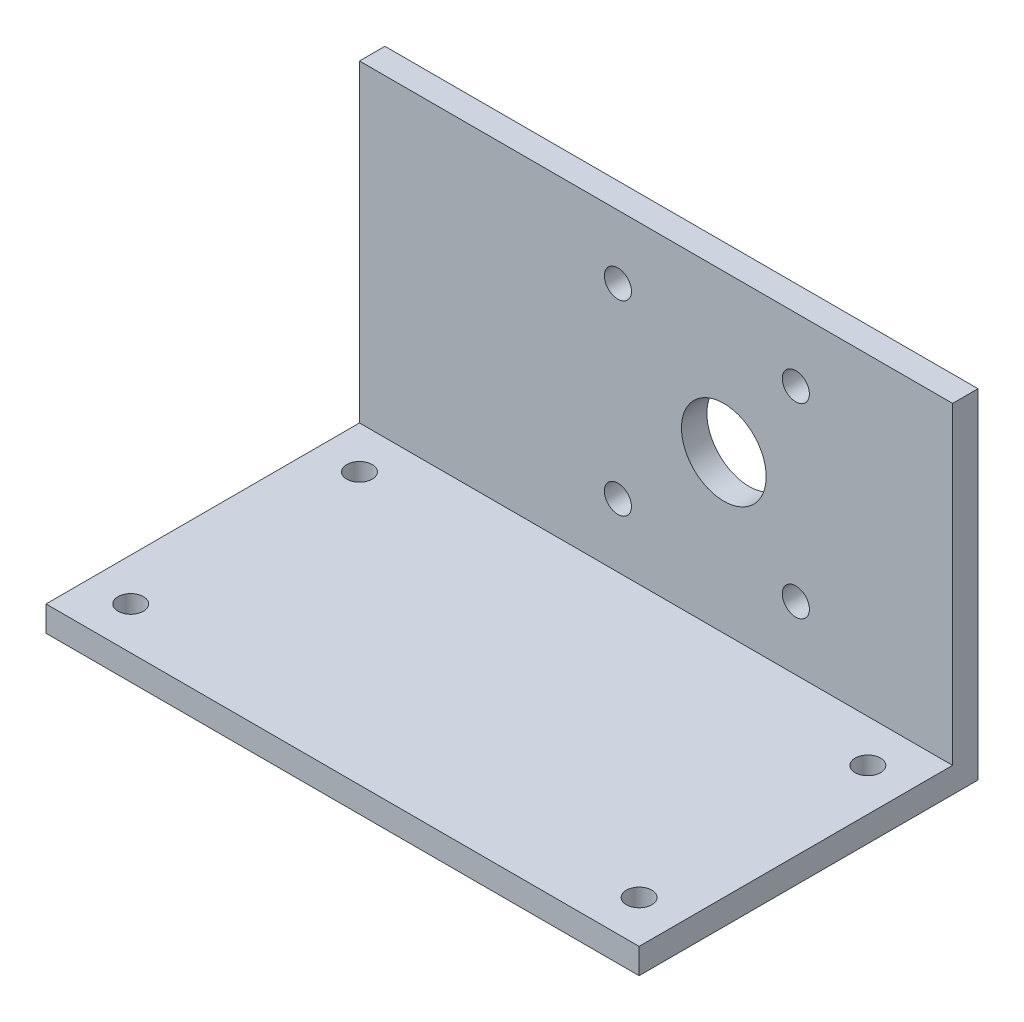
ISO-10303-21;
HEADER;
FILE_DESCRIPTION(('STEP AP214'),'2;1');
FILE_NAME('part.step','',(''),(''),'','','');
FILE_SCHEMA(('AUTOMOTIVE_DESIGN { 1 0 10303 214 1 1 1 1 }'));
ENDSEC;
DATA;
#1=APPLICATION_CONTEXT('core data for automotive mechanical design processes');
#2=APPLICATION_PROTOCOL_DEFINITION('international standard','automotive_design',2000,#1);
#3=PRODUCT_CONTEXT('',#1,'mechanical');
#4=PRODUCT('Part','Part','',(#3));
#5=PRODUCT_RELATED_PRODUCT_CATEGORY('part','',(#4));
#6=PRODUCT_DEFINITION_FORMATION('','',#4);
#7=PRODUCT_DEFINITION_CONTEXT('part definition',#1,'design');
#8=PRODUCT_DEFINITION('design','',#6,#7);
#9=PRODUCT_DEFINITION_SHAPE('','',#8);
#10=(LENGTH_UNIT() NAMED_UNIT(*) SI_UNIT(.MILLI.,.METRE.));
#11=(NAMED_UNIT(*) PLANE_ANGLE_UNIT() SI_UNIT($,.RADIAN.));
#12=(NAMED_UNIT(*) SI_UNIT($,.STERADIAN.) SOLID_ANGLE_UNIT());
#13=UNCERTAINTY_MEASURE_WITH_UNIT(LENGTH_MEASURE(1.E-05),#10,'distance_accuracy_value','');
#14=(GEOMETRIC_REPRESENTATION_CONTEXT(3) GLOBAL_UNCERTAINTY_ASSIGNED_CONTEXT((#13)) GLOBAL_UNIT_ASSIGNED_CONTEXT((#10,
#11,#12)) REPRESENTATION_CONTEXT('',''));
#15=CARTESIAN_POINT('',(0.,0.,0.));
#16=DIRECTION('',(0.,0.,1.));
#17=DIRECTION('',(1.,0.,0.));
#18=AXIS2_PLACEMENT_3D('',#15,#16,#17);
#19=CARTESIAN_POINT('',(70.,20.,-17.));
#20=DIRECTION('',(0.,0.,-1.));
#21=DIRECTION('',(0.,1.,0.));
#22=AXIS2_PLACEMENT_3D('',#19,#20,#21);
#23=PLANE('',#22);
#24=CARTESIAN_POINT('',(51.5,-9.50000000000001,-17.));
#25=DIRECTION('',(0.,0.,1.));
#26=DIRECTION('',(1.,0.,0.));
#27=AXIS2_PLACEMENT_3D('',#24,#25,#26);
#28=CIRCLE('',#27,1.6);
#29=CARTESIAN_POINT('',(53.1,-9.50000000000001,-17.));
#30=VERTEX_POINT('',#29);
#31=EDGE_CURVE('E164',#30,#30,#28,.T.);
#32=ORIENTED_EDGE('',*,*,#31,.F.);
#33=EDGE_LOOP('',(#32));
#34=FACE_BOUND('',#33,.T.);
#35=CARTESIAN_POINT('',(30.5,-9.50000000000001,-17.));
#36=DIRECTION('',(0.,0.,1.));
#37=DIRECTION('',(1.,0.,0.));
#38=AXIS2_PLACEMENT_3D('',#35,#36,#37);
#39=CIRCLE('',#38,1.6);
#40=CARTESIAN_POINT('',(32.1,-9.50000000000001,-17.));
#41=VERTEX_POINT('',#40);
#42=EDGE_CURVE('E168',#41,#41,#39,.T.);
#43=ORIENTED_EDGE('',*,*,#42,.F.);
#44=EDGE_LOOP('',(#43));
#45=FACE_BOUND('',#44,.T.);
#46=CARTESIAN_POINT('',(30.5,12.5,-17.));
#47=DIRECTION('',(0.,0.,1.));
#48=DIRECTION('',(1.,0.,0.));
#49=AXIS2_PLACEMENT_3D('',#46,#47,#48);
#50=CIRCLE('',#49,1.6);
#51=CARTESIAN_POINT('',(32.1,12.5,-17.));
#52=VERTEX_POINT('',#51);
#53=EDGE_CURVE('E172',#52,#52,#50,.T.);
#54=ORIENTED_EDGE('',*,*,#53,.F.);
#55=EDGE_LOOP('',(#54));
#56=FACE_BOUND('',#55,.T.);
#57=CARTESIAN_POINT('',(51.5,12.5,-17.));
#58=DIRECTION('',(0.,0.,1.));
#59=DIRECTION('',(1.,0.,0.));
#60=AXIS2_PLACEMENT_3D('',#57,#58,#59);
#61=CIRCLE('',#60,1.6);
#62=CARTESIAN_POINT('',(53.1,12.5,-17.));
#63=VERTEX_POINT('',#62);
#64=EDGE_CURVE('E176',#63,#63,#61,.T.);
#65=ORIENTED_EDGE('',*,*,#64,.F.);
#66=EDGE_LOOP('',(#65));
#67=FACE_BOUND('',#66,.T.);
#68=CARTESIAN_POINT('',(43.,1.5,-17.));
#69=DIRECTION('',(0.,0.,1.));
#70=DIRECTION('',(1.,0.,0.));
#71=AXIS2_PLACEMENT_3D('',#68,#69,#70);
#72=CIRCLE('',#71,5.);
#73=CARTESIAN_POINT('',(48.,1.5,-17.));
#74=VERTEX_POINT('',#73);
#75=EDGE_CURVE('E179',#74,#74,#72,.T.);
#76=ORIENTED_EDGE('',*,*,#75,.F.);
#77=EDGE_LOOP('',(#76));
#78=FACE_BOUND('',#77,.T.);
#79=DIRECTION('',(0.,-1.,0.));
#80=VECTOR('',#79,1.);
#81=CARTESIAN_POINT('',(0.,20.,-17.));
#82=LINE('',#81,#80);
#83=CARTESIAN_POINT('',(0.,20.,-17.));
#84=VERTEX_POINT('',#83);
#85=CARTESIAN_POINT('',(0.,-17.,-17.));
#86=VERTEX_POINT('',#85);
#87=EDGE_CURVE('E119',#84,#86,#82,.T.);
#88=ORIENTED_EDGE('',*,*,#87,.T.);
#89=DIRECTION('',(-1.,0.,0.));
#90=VECTOR('',#89,1.);
#91=CARTESIAN_POINT('',(70.,-17.,-17.));
#92=LINE('',#91,#90);
#93=CARTESIAN_POINT('',(70.,-17.,-17.));
#94=VERTEX_POINT('',#93);
#95=EDGE_CURVE('E11',#94,#86,#92,.T.);
#96=ORIENTED_EDGE('',*,*,#95,.F.);
#97=DIRECTION('',(0.,-1.,0.));
#98=VECTOR('',#97,1.);
#99=CARTESIAN_POINT('',(70.,20.,-17.));
#100=LINE('',#99,#98);
#101=CARTESIAN_POINT('',(70.,20.,-17.));
#102=VERTEX_POINT('',#101);
#103=EDGE_CURVE('E130',#102,#94,#100,.T.);
#104=ORIENTED_EDGE('',*,*,#103,.F.);
#105=DIRECTION('',(-1.,0.,0.));
#106=VECTOR('',#105,1.);
#107=CARTESIAN_POINT('',(70.,20.,-17.));
#108=LINE('',#107,#106);
#109=EDGE_CURVE('E115',#102,#84,#108,.T.);
#110=ORIENTED_EDGE('',*,*,#109,.T.);
#111=EDGE_LOOP('',(#88,#96,#104,#110));
#112=FACE_BOUND('',#111,.T.);
#113=ADVANCED_FACE('F35',(#34,#45,#56,#67,#78,#112),#23,.F.);
#114=CARTESIAN_POINT('',(70.,-17.,-17.));
#115=DIRECTION('',(0.,-1.,0.));
#116=DIRECTION('',(0.,0.,-1.));
#117=AXIS2_PLACEMENT_3D('',#114,#115,#116);
#118=PLANE('',#117);
#119=CARTESIAN_POINT('',(5.,-17.,-12.));
#120=DIRECTION('',(0.,1.,0.));
#121=DIRECTION('',(0.,0.,1.));
#122=AXIS2_PLACEMENT_3D('',#119,#120,#121);
#123=CIRCLE('',#122,1.5);
#124=CARTESIAN_POINT('',(5.,-17.,-10.5));
#125=VERTEX_POINT('',#124);
#126=EDGE_CURVE('E224',#125,#125,#123,.T.);
#127=ORIENTED_EDGE('',*,*,#126,.F.);
#128=EDGE_LOOP('',(#127));
#129=FACE_BOUND('',#128,.T.);
#130=CARTESIAN_POINT('',(5.,-17.,15.));
#131=DIRECTION('',(0.,1.,0.));
#132=DIRECTION('',(0.,0.,-1.));
#133=AXIS2_PLACEMENT_3D('',#130,#131,#132);
#134=CIRCLE('',#133,1.5);
#135=CARTESIAN_POINT('',(5.,-17.,16.5));
#136=VERTEX_POINT('',#135);
#137=EDGE_CURVE('E218',#136,#136,#134,.T.);
#138=ORIENTED_EDGE('',*,*,#137,.F.);
#139=EDGE_LOOP('',(#138));
#140=FACE_BOUND('',#139,.T.);
#141=CARTESIAN_POINT('',(65.,-17.,-12.));
#142=DIRECTION('',(0.,1.,0.));
#143=DIRECTION('',(0.,0.,-1.));
#144=AXIS2_PLACEMENT_3D('',#141,#142,#143);
#145=CIRCLE('',#144,1.5);
#146=CARTESIAN_POINT('',(65.,-17.,-10.5));
#147=VERTEX_POINT('',#146);
#148=EDGE_CURVE('E212',#147,#147,#145,.T.);
#149=ORIENTED_EDGE('',*,*,#148,.F.);
#150=EDGE_LOOP('',(#149));
#151=FACE_BOUND('',#150,.T.);
#152=CARTESIAN_POINT('',(65.,-17.,15.));
#153=DIRECTION('',(0.,1.,0.));
#154=DIRECTION('',(0.,0.,1.));
#155=AXIS2_PLACEMENT_3D('',#152,#153,#154);
#156=CIRCLE('',#155,1.5);
#157=CARTESIAN_POINT('',(65.,-17.,16.5));
#158=VERTEX_POINT('',#157);
#159=EDGE_CURVE('E206',#158,#158,#156,.T.);
#160=ORIENTED_EDGE('',*,*,#159,.F.);
#161=EDGE_LOOP('',(#160));
#162=FACE_BOUND('',#161,.T.);
#163=DIRECTION('',(0.,0.,1.));
#164=VECTOR('',#163,1.);
#165=CARTESIAN_POINT('',(0.,-17.,-17.));
#166=LINE('',#165,#164);
#167=CARTESIAN_POINT('',(0.,-17.,20.));
#168=VERTEX_POINT('',#167);
#169=EDGE_CURVE('E122',#86,#168,#166,.T.);
#170=ORIENTED_EDGE('',*,*,#169,.T.);
#171=DIRECTION('',(-1.,0.,0.));
#172=VECTOR('',#171,1.);
#173=CARTESIAN_POINT('',(70.,-17.,20.));
#174=LINE('',#173,#172);
#175=CARTESIAN_POINT('',(70.,-17.,20.));
#176=VERTEX_POINT('',#175);
#177=EDGE_CURVE('E43',#176,#168,#174,.T.);
#178=ORIENTED_EDGE('',*,*,#177,.F.);
#179=DIRECTION('',(0.,0.,1.));
#180=VECTOR('',#179,1.);
#181=CARTESIAN_POINT('',(70.,-17.,-17.));
#182=LINE('',#181,#180);
#183=EDGE_CURVE('E88',#94,#176,#182,.T.);
#184=ORIENTED_EDGE('',*,*,#183,.F.);
#185=ORIENTED_EDGE('',*,*,#95,.T.);
#186=EDGE_LOOP('',(#170,#178,#184,#185));
#187=FACE_BOUND('',#186,.T.);
#188=ADVANCED_FACE('F155',(#129,#140,#151,#162,#187),#118,.F.);
#189=CARTESIAN_POINT('',(70.,-17.,20.));
#190=DIRECTION('',(0.,0.,-1.));
#191=DIRECTION('',(-1.,0.,0.));
#192=AXIS2_PLACEMENT_3D('',#189,#190,#191);
#193=PLANE('',#192);
#194=DIRECTION('',(0.,-1.,0.));
#195=VECTOR('',#194,1.);
#196=CARTESIAN_POINT('',(0.,-17.,20.));
#197=LINE('',#196,#195);
#198=CARTESIAN_POINT('',(0.,-20.,20.));
#199=VERTEX_POINT('',#198);
#200=EDGE_CURVE('E125',#168,#199,#197,.T.);
#201=ORIENTED_EDGE('',*,*,#200,.T.);
#202=DIRECTION('',(-1.,0.,0.));
#203=VECTOR('',#202,1.);
#204=CARTESIAN_POINT('',(70.,-20.,20.));
#205=LINE('',#204,#203);
#206=CARTESIAN_POINT('',(70.,-20.,20.));
#207=VERTEX_POINT('',#206);
#208=EDGE_CURVE('E110',#207,#199,#205,.T.);
#209=ORIENTED_EDGE('',*,*,#208,.F.);
#210=DIRECTION('',(0.,-1.,0.));
#211=VECTOR('',#210,1.);
#212=CARTESIAN_POINT('',(70.,-17.,20.));
#213=LINE('',#212,#211);
#214=EDGE_CURVE('E101',#176,#207,#213,.T.);
#215=ORIENTED_EDGE('',*,*,#214,.F.);
#216=ORIENTED_EDGE('',*,*,#177,.T.);
#217=EDGE_LOOP('',(#201,#209,#215,#216));
#218=FACE_BOUND('',#217,.T.);
#219=ADVANCED_FACE('F136',(#218),#193,.F.);
#220=CARTESIAN_POINT('',(70.,-20.,20.));
#221=DIRECTION('',(0.,1.,0.));
#222=DIRECTION('',(0.,0.,1.));
#223=AXIS2_PLACEMENT_3D('',#220,#221,#222);
#224=PLANE('',#223);
#225=CARTESIAN_POINT('',(5.,-20.,-12.));
#226=DIRECTION('',(0.,1.,0.));
#227=DIRECTION('',(0.,0.,1.));
#228=AXIS2_PLACEMENT_3D('',#225,#226,#227);
#229=CIRCLE('',#228,1.5);
#230=CARTESIAN_POINT('',(5.,-20.,-10.5));
#231=VERTEX_POINT('',#230);
#232=EDGE_CURVE('E221',#231,#231,#229,.F.);
#233=ORIENTED_EDGE('',*,*,#232,.F.);
#234=EDGE_LOOP('',(#233));
#235=FACE_BOUND('',#234,.T.);
#236=CARTESIAN_POINT('',(5.,-20.,15.));
#237=DIRECTION('',(0.,1.,0.));
#238=DIRECTION('',(0.,0.,1.));
#239=AXIS2_PLACEMENT_3D('',#236,#237,#238);
#240=CIRCLE('',#239,1.5);
#241=CARTESIAN_POINT('',(5.,-20.,16.5));
#242=VERTEX_POINT('',#241);
#243=EDGE_CURVE('E215',#242,#242,#240,.F.);
#244=ORIENTED_EDGE('',*,*,#243,.F.);
#245=EDGE_LOOP('',(#244));
#246=FACE_BOUND('',#245,.T.);
#247=CARTESIAN_POINT('',(65.,-20.,-12.));
#248=DIRECTION('',(0.,1.,0.));
#249=DIRECTION('',(0.,0.,1.));
#250=AXIS2_PLACEMENT_3D('',#247,#248,#249);
#251=CIRCLE('',#250,1.5);
#252=CARTESIAN_POINT('',(65.,-20.,-10.5));
#253=VERTEX_POINT('',#252);
#254=EDGE_CURVE('E209',#253,#253,#251,.F.);
#255=ORIENTED_EDGE('',*,*,#254,.F.);
#256=EDGE_LOOP('',(#255));
#257=FACE_BOUND('',#256,.T.);
#258=CARTESIAN_POINT('',(65.,-20.,15.));
#259=DIRECTION('',(0.,1.,0.));
#260=DIRECTION('',(0.,0.,1.));
#261=AXIS2_PLACEMENT_3D('',#258,#259,#260);
#262=CIRCLE('',#261,1.5);
#263=CARTESIAN_POINT('',(65.,-20.,16.5));
#264=VERTEX_POINT('',#263);
#265=EDGE_CURVE('E203',#264,#264,#262,.F.);
#266=ORIENTED_EDGE('',*,*,#265,.F.);
#267=EDGE_LOOP('',(#266));
#268=FACE_BOUND('',#267,.T.);
#269=DIRECTION('',(0.,0.,-1.));
#270=VECTOR('',#269,1.);
#271=CARTESIAN_POINT('',(0.,-20.,20.));
#272=LINE('',#271,#270);
#273=CARTESIAN_POINT('',(0.,-20.,-20.));
#274=VERTEX_POINT('',#273);
#275=EDGE_CURVE('E109',#199,#274,#272,.T.);
#276=ORIENTED_EDGE('',*,*,#275,.T.);
#277=DIRECTION('',(-1.,0.,0.));
#278=VECTOR('',#277,1.);
#279=CARTESIAN_POINT('',(70.,-20.,-20.));
#280=LINE('',#279,#278);
#281=CARTESIAN_POINT('',(70.,-20.,-20.));
#282=VERTEX_POINT('',#281);
#283=EDGE_CURVE('E106',#282,#274,#280,.T.);
#284=ORIENTED_EDGE('',*,*,#283,.F.);
#285=DIRECTION('',(0.,0.,-1.));
#286=VECTOR('',#285,1.);
#287=CARTESIAN_POINT('',(70.,-20.,20.));
#288=LINE('',#287,#286);
#289=EDGE_CURVE('E95',#207,#282,#288,.T.);
#290=ORIENTED_EDGE('',*,*,#289,.F.);
#291=ORIENTED_EDGE('',*,*,#208,.T.);
#292=EDGE_LOOP('',(#276,#284,#290,#291));
#293=FACE_BOUND('',#292,.T.);
#294=ADVANCED_FACE('F107',(#235,#246,#257,#268,#293),#224,.F.);
#295=CARTESIAN_POINT('',(70.,20.,-20.));
#296=DIRECTION('',(0.,0.,1.));
#297=DIRECTION('',(0.,-1.,0.));
#298=AXIS2_PLACEMENT_3D('',#295,#296,#297);
#299=PLANE('',#298);
#300=CARTESIAN_POINT('',(51.5,-9.50000000000001,-20.));
#301=DIRECTION('',(0.,0.,1.));
#302=DIRECTION('',(0.,-1.,0.));
#303=AXIS2_PLACEMENT_3D('',#300,#301,#302);
#304=CIRCLE('',#303,1.6);
#305=CARTESIAN_POINT('',(51.5,-11.1,-20.));
#306=VERTEX_POINT('',#305);
#307=EDGE_CURVE('E199',#306,#306,#304,.F.);
#308=ORIENTED_EDGE('',*,*,#307,.F.);
#309=EDGE_LOOP('',(#308));
#310=FACE_BOUND('',#309,.T.);
#311=CARTESIAN_POINT('',(30.5,-9.50000000000001,-20.));
#312=DIRECTION('',(0.,0.,1.));
#313=DIRECTION('',(0.,-1.,0.));
#314=AXIS2_PLACEMENT_3D('',#311,#312,#313);
#315=CIRCLE('',#314,1.6);
#316=CARTESIAN_POINT('',(30.5,-11.1,-20.));
#317=VERTEX_POINT('',#316);
#318=EDGE_CURVE('E195',#317,#317,#315,.F.);
#319=ORIENTED_EDGE('',*,*,#318,.F.);
#320=EDGE_LOOP('',(#319));
#321=FACE_BOUND('',#320,.T.);
#322=CARTESIAN_POINT('',(30.5,12.5,-20.));
#323=DIRECTION('',(0.,0.,1.));
#324=DIRECTION('',(0.,-1.,0.));
#325=AXIS2_PLACEMENT_3D('',#322,#323,#324);
#326=CIRCLE('',#325,1.6);
#327=CARTESIAN_POINT('',(30.5,10.9,-20.));
#328=VERTEX_POINT('',#327);
#329=EDGE_CURVE('E191',#328,#328,#326,.F.);
#330=ORIENTED_EDGE('',*,*,#329,.F.);
#331=EDGE_LOOP('',(#330));
#332=FACE_BOUND('',#331,.T.);
#333=CARTESIAN_POINT('',(51.5,12.5,-20.));
#334=DIRECTION('',(0.,0.,1.));
#335=DIRECTION('',(0.,-1.,0.));
#336=AXIS2_PLACEMENT_3D('',#333,#334,#335);
#337=CIRCLE('',#336,1.6);
#338=CARTESIAN_POINT('',(51.5,10.9,-20.));
#339=VERTEX_POINT('',#338);
#340=EDGE_CURVE('E181',#339,#339,#337,.F.);
#341=ORIENTED_EDGE('',*,*,#340,.F.);
#342=EDGE_LOOP('',(#341));
#343=FACE_BOUND('',#342,.T.);
#344=CARTESIAN_POINT('',(43.,1.5,-20.));
#345=DIRECTION('',(0.,0.,1.));
#346=DIRECTION('',(0.,-1.,0.));
#347=AXIS2_PLACEMENT_3D('',#344,#345,#346);
#348=CIRCLE('',#347,5.);
#349=CARTESIAN_POINT('',(43.,-3.5,-20.));
#350=VERTEX_POINT('',#349);
#351=EDGE_CURVE('E123',#350,#350,#348,.F.);
#352=ORIENTED_EDGE('',*,*,#351,.F.);
#353=EDGE_LOOP('',(#352));
#354=FACE_BOUND('',#353,.T.);
#355=DIRECTION('',(0.,1.,0.));
#356=VECTOR('',#355,1.);
#357=CARTESIAN_POINT('',(0.,20.,-20.));
#358=LINE('',#357,#356);
#359=CARTESIAN_POINT('',(0.,20.,-20.));
#360=VERTEX_POINT('',#359);
#361=EDGE_CURVE('E74',#274,#360,#358,.T.);
#362=ORIENTED_EDGE('',*,*,#361,.T.);
#363=DIRECTION('',(-1.,0.,0.));
#364=VECTOR('',#363,1.);
#365=CARTESIAN_POINT('',(70.,20.,-20.));
#366=LINE('',#365,#364);
#367=CARTESIAN_POINT('',(70.,20.,-20.));
#368=VERTEX_POINT('',#367);
#369=EDGE_CURVE('E111',#368,#360,#366,.T.);
#370=ORIENTED_EDGE('',*,*,#369,.F.);
#371=DIRECTION('',(0.,1.,0.));
#372=VECTOR('',#371,1.);
#373=CARTESIAN_POINT('',(70.,20.,-20.));
#374=LINE('',#373,#372);
#375=EDGE_CURVE('E99',#282,#368,#374,.T.);
#376=ORIENTED_EDGE('',*,*,#375,.F.);
#377=ORIENTED_EDGE('',*,*,#283,.T.);
#378=EDGE_LOOP('',(#362,#370,#376,#377));
#379=FACE_BOUND('',#378,.T.);
#380=ADVANCED_FACE('F113',(#310,#321,#332,#343,#354,#379),#299,.F.);
#381=CARTESIAN_POINT('',(70.,20.,-17.));
#382=DIRECTION('',(0.,-1.,0.));
#383=DIRECTION('',(0.,0.,-1.));
#384=AXIS2_PLACEMENT_3D('',#381,#382,#383);
#385=PLANE('',#384);
#386=DIRECTION('',(0.,0.,1.));
#387=VECTOR('',#386,1.);
#388=CARTESIAN_POINT('',(0.,20.,-17.));
#389=LINE('',#388,#387);
#390=EDGE_CURVE('E80',#360,#84,#389,.T.);
#391=ORIENTED_EDGE('',*,*,#390,.T.);
#392=ORIENTED_EDGE('',*,*,#109,.F.);
#393=DIRECTION('',(0.,0.,1.));
#394=VECTOR('',#393,1.);
#395=CARTESIAN_POINT('',(70.,20.,-17.));
#396=LINE('',#395,#394);
#397=EDGE_CURVE('E51',#368,#102,#396,.T.);
#398=ORIENTED_EDGE('',*,*,#397,.F.);
#399=ORIENTED_EDGE('',*,*,#369,.T.);
#400=EDGE_LOOP('',(#391,#392,#398,#399));
#401=FACE_BOUND('',#400,.T.);
#402=ADVANCED_FACE('F143',(#401),#385,.F.);
#403=CARTESIAN_POINT('',(70.,0.,0.));
#404=DIRECTION('',(-1.,0.,0.));
#405=DIRECTION('',(0.,0.,1.));
#406=AXIS2_PLACEMENT_3D('',#403,#404,#405);
#407=PLANE('',#406);
#408=ORIENTED_EDGE('',*,*,#103,.T.);
#409=ORIENTED_EDGE('',*,*,#183,.T.);
#410=ORIENTED_EDGE('',*,*,#214,.T.);
#411=ORIENTED_EDGE('',*,*,#289,.T.);
#412=ORIENTED_EDGE('',*,*,#375,.T.);
#413=ORIENTED_EDGE('',*,*,#397,.T.);
#414=EDGE_LOOP('',(#408,#409,#410,#411,#412,#413));
#415=FACE_BOUND('',#414,.T.);
#416=ADVANCED_FACE('F97',(#415),#407,.F.);
#417=CARTESIAN_POINT('',(0.,0.,0.));
#418=DIRECTION('',(-1.,0.,0.));
#419=DIRECTION('',(0.,0.,1.));
#420=AXIS2_PLACEMENT_3D('',#417,#418,#419);
#421=PLANE('',#420);
#422=ORIENTED_EDGE('',*,*,#87,.F.);
#423=ORIENTED_EDGE('',*,*,#390,.F.);
#424=ORIENTED_EDGE('',*,*,#361,.F.);
#425=ORIENTED_EDGE('',*,*,#275,.F.);
#426=ORIENTED_EDGE('',*,*,#200,.F.);
#427=ORIENTED_EDGE('',*,*,#169,.F.);
#428=EDGE_LOOP('',(#422,#423,#424,#425,#426,#427));
#429=FACE_BOUND('',#428,.T.);
#430=ADVANCED_FACE('F139',(#429),#421,.T.);
#431=CARTESIAN_POINT('',(43.,1.5,-34.1421356237309));
#432=DIRECTION('',(0.,0.,1.));
#433=DIRECTION('',(1.,0.,0.));
#434=AXIS2_PLACEMENT_3D('',#431,#432,#433);
#435=CYLINDRICAL_SURFACE('',#434,5.);
#436=ORIENTED_EDGE('',*,*,#351,.T.);
#437=EDGE_LOOP('',(#436));
#438=FACE_BOUND('',#437,.T.);
#439=ORIENTED_EDGE('',*,*,#75,.T.);
#440=EDGE_LOOP('',(#439));
#441=FACE_BOUND('',#440,.T.);
#442=ADVANCED_FACE('F264',(#438,#441),#435,.F.);
#443=CARTESIAN_POINT('',(51.5,12.5,-34.1421356237309));
#444=DIRECTION('',(0.,0.,1.));
#445=DIRECTION('',(1.,0.,0.));
#446=AXIS2_PLACEMENT_3D('',#443,#444,#445);
#447=CYLINDRICAL_SURFACE('',#446,1.6);
#448=ORIENTED_EDGE('',*,*,#340,.T.);
#449=EDGE_LOOP('',(#448));
#450=FACE_BOUND('',#449,.T.);
#451=ORIENTED_EDGE('',*,*,#64,.T.);
#452=EDGE_LOOP('',(#451));
#453=FACE_BOUND('',#452,.T.);
#454=ADVANCED_FACE('F260',(#450,#453),#447,.F.);
#455=CARTESIAN_POINT('',(30.5,12.5,-34.1421356237309));
#456=DIRECTION('',(0.,0.,1.));
#457=DIRECTION('',(1.,0.,0.));
#458=AXIS2_PLACEMENT_3D('',#455,#456,#457);
#459=CYLINDRICAL_SURFACE('',#458,1.6);
#460=ORIENTED_EDGE('',*,*,#329,.T.);
#461=EDGE_LOOP('',(#460));
#462=FACE_BOUND('',#461,.T.);
#463=ORIENTED_EDGE('',*,*,#53,.T.);
#464=EDGE_LOOP('',(#463));
#465=FACE_BOUND('',#464,.T.);
#466=ADVANCED_FACE('F256',(#462,#465),#459,.F.);
#467=CARTESIAN_POINT('',(30.5,-9.50000000000001,-34.1421356237309));
#468=DIRECTION('',(0.,0.,1.));
#469=DIRECTION('',(1.,0.,0.));
#470=AXIS2_PLACEMENT_3D('',#467,#468,#469);
#471=CYLINDRICAL_SURFACE('',#470,1.6);
#472=ORIENTED_EDGE('',*,*,#318,.T.);
#473=EDGE_LOOP('',(#472));
#474=FACE_BOUND('',#473,.T.);
#475=ORIENTED_EDGE('',*,*,#42,.T.);
#476=EDGE_LOOP('',(#475));
#477=FACE_BOUND('',#476,.T.);
#478=ADVANCED_FACE('F249',(#474,#477),#471,.F.);
#479=CARTESIAN_POINT('',(51.5,-9.50000000000001,-34.1421356237309));
#480=DIRECTION('',(0.,0.,1.));
#481=DIRECTION('',(1.,0.,0.));
#482=AXIS2_PLACEMENT_3D('',#479,#480,#481);
#483=CYLINDRICAL_SURFACE('',#482,1.6);
#484=ORIENTED_EDGE('',*,*,#307,.T.);
#485=EDGE_LOOP('',(#484));
#486=FACE_BOUND('',#485,.T.);
#487=ORIENTED_EDGE('',*,*,#31,.T.);
#488=EDGE_LOOP('',(#487));
#489=FACE_BOUND('',#488,.T.);
#490=ADVANCED_FACE('F239',(#486,#489),#483,.F.);
#491=CARTESIAN_POINT('',(65.,-24.2426406871193,15.));
#492=DIRECTION('',(0.,1.,0.));
#493=DIRECTION('',(0.,0.,1.));
#494=AXIS2_PLACEMENT_3D('',#491,#492,#493);
#495=CYLINDRICAL_SURFACE('',#494,1.5);
#496=CARTESIAN_POINT('',(65.,-20.,16.5));
#497=CARTESIAN_POINT('',(65.,-19.96875,16.5));
#498=CARTESIAN_POINT('',(65.,-19.9375,16.5));
#499=CARTESIAN_POINT('',(65.,-19.875,16.5));
#500=CARTESIAN_POINT('',(65.,-19.84375,16.5));
#501=CARTESIAN_POINT('',(65.,-19.78125,16.5));
#502=CARTESIAN_POINT('',(65.,-19.75,16.5));
#503=CARTESIAN_POINT('',(65.,-19.6875,16.5));
#504=CARTESIAN_POINT('',(65.,-19.65625,16.5));
#505=CARTESIAN_POINT('',(65.,-19.59375,16.5));
#506=CARTESIAN_POINT('',(65.,-19.5625,16.5));
#507=CARTESIAN_POINT('',(65.,-19.5,16.5));
#508=CARTESIAN_POINT('',(65.,-19.46875,16.5));
#509=CARTESIAN_POINT('',(65.,-19.40625,16.5));
#510=CARTESIAN_POINT('',(65.,-19.375,16.5));
#511=CARTESIAN_POINT('',(65.,-19.3125,16.5));
#512=CARTESIAN_POINT('',(65.,-19.28125,16.5));
#513=CARTESIAN_POINT('',(65.,-19.21875,16.5));
#514=CARTESIAN_POINT('',(65.,-19.1875,16.5));
#515=CARTESIAN_POINT('',(65.,-19.125,16.5));
#516=CARTESIAN_POINT('',(65.,-19.09375,16.5));
#517=CARTESIAN_POINT('',(65.,-19.03125,16.5));
#518=CARTESIAN_POINT('',(65.,-19.,16.5));
#519=CARTESIAN_POINT('',(65.,-18.9375,16.5));
#520=CARTESIAN_POINT('',(65.,-18.90625,16.5));
#521=CARTESIAN_POINT('',(65.,-18.84375,16.5));
#522=CARTESIAN_POINT('',(65.,-18.8125,16.5));
#523=CARTESIAN_POINT('',(65.,-18.75,16.5));
#524=CARTESIAN_POINT('',(65.,-18.71875,16.5));
#525=CARTESIAN_POINT('',(65.,-18.65625,16.5));
#526=CARTESIAN_POINT('',(65.,-18.625,16.5));
#527=CARTESIAN_POINT('',(65.,-18.5625,16.5));
#528=CARTESIAN_POINT('',(65.,-18.53125,16.5));
#529=CARTESIAN_POINT('',(65.,-18.46875,16.5));
#530=CARTESIAN_POINT('',(65.,-18.4375,16.5));
#531=CARTESIAN_POINT('',(65.,-18.375,16.5));
#532=CARTESIAN_POINT('',(65.,-18.34375,16.5));
#533=CARTESIAN_POINT('',(65.,-18.28125,16.5));
#534=CARTESIAN_POINT('',(65.,-18.25,16.5));
#535=CARTESIAN_POINT('',(65.,-18.1875,16.5));
#536=CARTESIAN_POINT('',(65.,-18.15625,16.5));
#537=CARTESIAN_POINT('',(65.,-18.09375,16.5));
#538=CARTESIAN_POINT('',(65.,-18.0625,16.5));
#539=CARTESIAN_POINT('',(65.,-18.,16.5));
#540=CARTESIAN_POINT('',(65.,-17.96875,16.5));
#541=CARTESIAN_POINT('',(65.,-17.90625,16.5));
#542=CARTESIAN_POINT('',(65.,-17.875,16.5));
#543=CARTESIAN_POINT('',(65.,-17.8125,16.5));
#544=CARTESIAN_POINT('',(65.,-17.78125,16.5));
#545=CARTESIAN_POINT('',(65.,-17.71875,16.5));
#546=CARTESIAN_POINT('',(65.,-17.6875,16.5));
#547=CARTESIAN_POINT('',(65.,-17.625,16.5));
#548=CARTESIAN_POINT('',(65.,-17.59375,16.5));
#549=CARTESIAN_POINT('',(65.,-17.53125,16.5));
#550=CARTESIAN_POINT('',(65.,-17.5,16.5));
#551=CARTESIAN_POINT('',(65.,-17.4375,16.5));
#552=CARTESIAN_POINT('',(65.,-17.40625,16.5));
#553=CARTESIAN_POINT('',(65.,-17.34375,16.5));
#554=CARTESIAN_POINT('',(65.,-17.3125,16.5));
#555=CARTESIAN_POINT('',(65.,-17.25,16.5));
#556=CARTESIAN_POINT('',(65.,-17.21875,16.5));
#557=CARTESIAN_POINT('',(65.,-17.15625,16.5));
#558=CARTESIAN_POINT('',(65.,-17.125,16.5));
#559=CARTESIAN_POINT('',(65.,-17.0625,16.5));
#560=CARTESIAN_POINT('',(65.,-17.03125,16.5));
#561=CARTESIAN_POINT('',(65.,-17.,16.5));
#562=B_SPLINE_CURVE_WITH_KNOTS('',3,(#496,#497,#498,#499,#500,#501,#502,#503,#504,#505,#506,
#507,#508,#509,#510,#511,#512,#513,#514,#515,#516,#517,#518,#519,#520,#521,#522,#523,#524,#525,
#526,#527,#528,#529,#530,#531,#532,#533,#534,#535,#536,#537,#538,#539,#540,#541,#542,#543,#544,
#545,#546,#547,#548,#549,#550,#551,#552,#553,#554,#555,#556,#557,#558,#559,#560,#561),
.UNSPECIFIED.,.F.,.F.,(4,2,2,2,2,2,2,2,2,2,2,2,2,2,2,2,2,2,2,2,2,2,2,2,2,2,2,2,2,2,2,2,4),(0.,
0.0937500000000001,0.1875,0.28125,0.375000000000004,0.46875,0.562500000000004,0.656250000000001,
0.750000000000004,0.843750000000004,0.937500000000004,1.03125,1.125,1.21875,1.3125,1.40625,1.5,
1.59375,1.6875,1.78125000000001,1.87500000000001,1.96875000000001,2.06250000000001,
2.15625000000001,2.25000000000001,2.34375000000001,2.43750000000001,2.53125000000001,
2.62500000000001,2.71875000000001,2.81250000000001,2.90625000000001,3.00000000000001),.UNSPECIFIED.);
#563=EDGE_CURVE('BSEAM236',#264,#158,#562,.T.);
#564=ORIENTED_EDGE('',*,*,#265,.T.);
#565=ORIENTED_EDGE('',*,*,#159,.T.);
#566=ORIENTED_EDGE('',*,*,#563,.T.);
#567=ORIENTED_EDGE('',*,*,#563,.F.);
#568=EDGE_LOOP('',(#564,#566,#565,#567));
#569=FACE_BOUND('',#568,.T.);
#570=ADVANCED_FACE('F236',(#569),#495,.F.);
#571=CARTESIAN_POINT('',(65.,-24.2426406871193,-12.));
#572=DIRECTION('',(0.,1.,0.));
#573=DIRECTION('',(0.,0.,1.));
#574=AXIS2_PLACEMENT_3D('',#571,#572,#573);
#575=CYLINDRICAL_SURFACE('',#574,1.5);
#576=CARTESIAN_POINT('',(65.,-20.,-10.5));
#577=CARTESIAN_POINT('',(65.,-19.96875,-10.5));
#578=CARTESIAN_POINT('',(65.,-19.9375,-10.5));
#579=CARTESIAN_POINT('',(65.,-19.875,-10.5));
#580=CARTESIAN_POINT('',(65.,-19.84375,-10.5));
#581=CARTESIAN_POINT('',(65.,-19.78125,-10.5));
#582=CARTESIAN_POINT('',(65.,-19.75,-10.5));
#583=CARTESIAN_POINT('',(65.,-19.6875,-10.5));
#584=CARTESIAN_POINT('',(65.,-19.65625,-10.5));
#585=CARTESIAN_POINT('',(65.,-19.59375,-10.5));
#586=CARTESIAN_POINT('',(65.,-19.5625,-10.5));
#587=CARTESIAN_POINT('',(65.,-19.5,-10.5));
#588=CARTESIAN_POINT('',(65.,-19.46875,-10.5));
#589=CARTESIAN_POINT('',(65.,-19.40625,-10.5));
#590=CARTESIAN_POINT('',(65.,-19.375,-10.5));
#591=CARTESIAN_POINT('',(65.,-19.3125,-10.5));
#592=CARTESIAN_POINT('',(65.,-19.28125,-10.5));
#593=CARTESIAN_POINT('',(65.,-19.21875,-10.5));
#594=CARTESIAN_POINT('',(65.,-19.1875,-10.5));
#595=CARTESIAN_POINT('',(65.,-19.125,-10.5));
#596=CARTESIAN_POINT('',(65.,-19.09375,-10.5));
#597=CARTESIAN_POINT('',(65.,-19.03125,-10.5));
#598=CARTESIAN_POINT('',(65.,-19.,-10.5));
#599=CARTESIAN_POINT('',(65.,-18.9375,-10.5));
#600=CARTESIAN_POINT('',(65.,-18.90625,-10.5));
#601=CARTESIAN_POINT('',(65.,-18.84375,-10.5));
#602=CARTESIAN_POINT('',(65.,-18.8125,-10.5));
#603=CARTESIAN_POINT('',(65.,-18.75,-10.5));
#604=CARTESIAN_POINT('',(65.,-18.71875,-10.5));
#605=CARTESIAN_POINT('',(65.,-18.65625,-10.5));
#606=CARTESIAN_POINT('',(65.,-18.625,-10.5));
#607=CARTESIAN_POINT('',(65.,-18.5625,-10.5));
#608=CARTESIAN_POINT('',(65.,-18.53125,-10.5));
#609=CARTESIAN_POINT('',(65.,-18.46875,-10.5));
#610=CARTESIAN_POINT('',(65.,-18.4375,-10.5));
#611=CARTESIAN_POINT('',(65.,-18.375,-10.5));
#612=CARTESIAN_POINT('',(65.,-18.34375,-10.5));
#613=CARTESIAN_POINT('',(65.,-18.28125,-10.5));
#614=CARTESIAN_POINT('',(65.,-18.25,-10.5));
#615=CARTESIAN_POINT('',(65.,-18.1875,-10.5));
#616=CARTESIAN_POINT('',(65.,-18.15625,-10.5));
#617=CARTESIAN_POINT('',(65.,-18.09375,-10.5));
#618=CARTESIAN_POINT('',(65.,-18.0625,-10.5));
#619=CARTESIAN_POINT('',(65.,-18.,-10.5));
#620=CARTESIAN_POINT('',(65.,-17.96875,-10.5));
#621=CARTESIAN_POINT('',(65.,-17.90625,-10.5));
#622=CARTESIAN_POINT('',(65.,-17.875,-10.5));
#623=CARTESIAN_POINT('',(65.,-17.8125,-10.5));
#624=CARTESIAN_POINT('',(65.,-17.78125,-10.5));
#625=CARTESIAN_POINT('',(65.,-17.71875,-10.5));
#626=CARTESIAN_POINT('',(65.,-17.6875,-10.5));
#627=CARTESIAN_POINT('',(65.,-17.625,-10.5));
#628=CARTESIAN_POINT('',(65.,-17.59375,-10.5));
#629=CARTESIAN_POINT('',(65.,-17.53125,-10.5));
#630=CARTESIAN_POINT('',(65.,-17.5,-10.5));
#631=CARTESIAN_POINT('',(65.,-17.4375,-10.5));
#632=CARTESIAN_POINT('',(65.,-17.40625,-10.5));
#633=CARTESIAN_POINT('',(65.,-17.34375,-10.5));
#634=CARTESIAN_POINT('',(65.,-17.3125,-10.5));
#635=CARTESIAN_POINT('',(65.,-17.25,-10.5));
#636=CARTESIAN_POINT('',(65.,-17.21875,-10.5));
#637=CARTESIAN_POINT('',(65.,-17.15625,-10.5));
#638=CARTESIAN_POINT('',(65.,-17.125,-10.5));
#639=CARTESIAN_POINT('',(65.,-17.0625,-10.5));
#640=CARTESIAN_POINT('',(65.,-17.03125,-10.5));
#641=CARTESIAN_POINT('',(65.,-17.,-10.5));
#642=B_SPLINE_CURVE_WITH_KNOTS('',3,(#576,#577,#578,#579,#580,#581,#582,#583,#584,#585,#586,
#587,#588,#589,#590,#591,#592,#593,#594,#595,#596,#597,#598,#599,#600,#601,#602,#603,#604,#605,
#606,#607,#608,#609,#610,#611,#612,#613,#614,#615,#616,#617,#618,#619,#620,#621,#622,#623,#624,
#625,#626,#627,#628,#629,#630,#631,#632,#633,#634,#635,#636,#637,#638,#639,#640,#641),
.UNSPECIFIED.,.F.,.F.,(4,2,2,2,2,2,2,2,2,2,2,2,2,2,2,2,2,2,2,2,2,2,2,2,2,2,2,2,2,2,2,2,4),(0.,
0.0937500000000001,0.1875,0.28125,0.375000000000004,0.46875,0.562500000000004,0.656250000000001,
0.750000000000004,0.843750000000004,0.937500000000004,1.03125,1.125,1.21875,1.3125,1.40625,1.5,
1.59375,1.6875,1.78125000000001,1.87500000000001,1.96875000000001,2.06250000000001,
2.15625000000001,2.25000000000001,2.34375000000001,2.43750000000001,2.53125000000001,
2.62500000000001,2.71875000000001,2.81250000000001,2.90625000000001,3.00000000000001),.UNSPECIFIED.);
#643=EDGE_CURVE('BSEAM238',#253,#147,#642,.T.);
#644=ORIENTED_EDGE('',*,*,#254,.T.);
#645=ORIENTED_EDGE('',*,*,#148,.T.);
#646=ORIENTED_EDGE('',*,*,#643,.T.);
#647=ORIENTED_EDGE('',*,*,#643,.F.);
#648=EDGE_LOOP('',(#644,#646,#645,#647));
#649=FACE_BOUND('',#648,.T.);
#650=ADVANCED_FACE('F238',(#649),#575,.F.);
#651=CARTESIAN_POINT('',(5.,-24.2426406871193,15.));
#652=DIRECTION('',(0.,1.,0.));
#653=DIRECTION('',(0.,0.,1.));
#654=AXIS2_PLACEMENT_3D('',#651,#652,#653);
#655=CYLINDRICAL_SURFACE('',#654,1.5);
#656=CARTESIAN_POINT('',(5.,-20.,16.5));
#657=CARTESIAN_POINT('',(5.,-19.96875,16.5));
#658=CARTESIAN_POINT('',(5.,-19.9375,16.5));
#659=CARTESIAN_POINT('',(5.,-19.875,16.5));
#660=CARTESIAN_POINT('',(5.,-19.84375,16.5));
#661=CARTESIAN_POINT('',(5.,-19.78125,16.5));
#662=CARTESIAN_POINT('',(5.,-19.75,16.5));
#663=CARTESIAN_POINT('',(5.,-19.6875,16.5));
#664=CARTESIAN_POINT('',(5.,-19.65625,16.5));
#665=CARTESIAN_POINT('',(5.,-19.59375,16.5));
#666=CARTESIAN_POINT('',(5.,-19.5625,16.5));
#667=CARTESIAN_POINT('',(5.,-19.5,16.5));
#668=CARTESIAN_POINT('',(5.,-19.46875,16.5));
#669=CARTESIAN_POINT('',(5.,-19.40625,16.5));
#670=CARTESIAN_POINT('',(5.,-19.375,16.5));
#671=CARTESIAN_POINT('',(5.,-19.3125,16.5));
#672=CARTESIAN_POINT('',(5.,-19.28125,16.5));
#673=CARTESIAN_POINT('',(5.,-19.21875,16.5));
#674=CARTESIAN_POINT('',(5.,-19.1875,16.5));
#675=CARTESIAN_POINT('',(5.,-19.125,16.5));
#676=CARTESIAN_POINT('',(5.,-19.09375,16.5));
#677=CARTESIAN_POINT('',(5.,-19.03125,16.5));
#678=CARTESIAN_POINT('',(5.,-19.,16.5));
#679=CARTESIAN_POINT('',(5.,-18.9375,16.5));
#680=CARTESIAN_POINT('',(5.,-18.90625,16.5));
#681=CARTESIAN_POINT('',(5.,-18.84375,16.5));
#682=CARTESIAN_POINT('',(5.,-18.8125,16.5));
#683=CARTESIAN_POINT('',(5.,-18.75,16.5));
#684=CARTESIAN_POINT('',(5.,-18.71875,16.5));
#685=CARTESIAN_POINT('',(5.,-18.65625,16.5));
#686=CARTESIAN_POINT('',(5.,-18.625,16.5));
#687=CARTESIAN_POINT('',(5.,-18.5625,16.5));
#688=CARTESIAN_POINT('',(5.,-18.53125,16.5));
#689=CARTESIAN_POINT('',(5.,-18.46875,16.5));
#690=CARTESIAN_POINT('',(5.,-18.4375,16.5));
#691=CARTESIAN_POINT('',(5.,-18.375,16.5));
#692=CARTESIAN_POINT('',(5.,-18.34375,16.5));
#693=CARTESIAN_POINT('',(5.,-18.28125,16.5));
#694=CARTESIAN_POINT('',(5.,-18.25,16.5));
#695=CARTESIAN_POINT('',(5.,-18.1875,16.5));
#696=CARTESIAN_POINT('',(5.,-18.15625,16.5));
#697=CARTESIAN_POINT('',(5.,-18.09375,16.5));
#698=CARTESIAN_POINT('',(5.,-18.0625,16.5));
#699=CARTESIAN_POINT('',(5.,-18.,16.5));
#700=CARTESIAN_POINT('',(5.,-17.96875,16.5));
#701=CARTESIAN_POINT('',(5.,-17.90625,16.5));
#702=CARTESIAN_POINT('',(5.,-17.875,16.5));
#703=CARTESIAN_POINT('',(5.,-17.8125,16.5));
#704=CARTESIAN_POINT('',(5.,-17.78125,16.5));
#705=CARTESIAN_POINT('',(5.,-17.71875,16.5));
#706=CARTESIAN_POINT('',(5.,-17.6875,16.5));
#707=CARTESIAN_POINT('',(5.,-17.625,16.5));
#708=CARTESIAN_POINT('',(5.,-17.59375,16.5));
#709=CARTESIAN_POINT('',(5.,-17.53125,16.5));
#710=CARTESIAN_POINT('',(5.,-17.5,16.5));
#711=CARTESIAN_POINT('',(5.,-17.4375,16.5));
#712=CARTESIAN_POINT('',(5.,-17.40625,16.5));
#713=CARTESIAN_POINT('',(5.,-17.34375,16.5));
#714=CARTESIAN_POINT('',(5.,-17.3125,16.5));
#715=CARTESIAN_POINT('',(5.,-17.25,16.5));
#716=CARTESIAN_POINT('',(5.,-17.21875,16.5));
#717=CARTESIAN_POINT('',(5.,-17.15625,16.5));
#718=CARTESIAN_POINT('',(5.,-17.125,16.5));
#719=CARTESIAN_POINT('',(5.,-17.0625,16.5));
#720=CARTESIAN_POINT('',(5.,-17.03125,16.5));
#721=CARTESIAN_POINT('',(5.,-17.,16.5));
#722=B_SPLINE_CURVE_WITH_KNOTS('',3,(#656,#657,#658,#659,#660,#661,#662,#663,#664,#665,#666,
#667,#668,#669,#670,#671,#672,#673,#674,#675,#676,#677,#678,#679,#680,#681,#682,#683,#684,#685,
#686,#687,#688,#689,#690,#691,#692,#693,#694,#695,#696,#697,#698,#699,#700,#701,#702,#703,#704,
#705,#706,#707,#708,#709,#710,#711,#712,#713,#714,#715,#716,#717,#718,#719,#720,#721),
.UNSPECIFIED.,.F.,.F.,(4,2,2,2,2,2,2,2,2,2,2,2,2,2,2,2,2,2,2,2,2,2,2,2,2,2,2,2,2,2,2,2,4),(0.,
0.0937500000000001,0.1875,0.28125,0.375000000000004,0.46875,0.562500000000004,0.656250000000001,
0.750000000000004,0.843750000000004,0.937500000000004,1.03125,1.125,1.21875,1.3125,1.40625,1.5,
1.59375,1.6875,1.78125000000001,1.87500000000001,1.96875000000001,2.06250000000001,
2.15625000000001,2.25000000000001,2.34375000000001,2.43750000000001,2.53125000000001,
2.62500000000001,2.71875000000001,2.81250000000001,2.90625000000001,3.00000000000001),.UNSPECIFIED.);
#723=EDGE_CURVE('BSEAM246',#242,#136,#722,.T.);
#724=ORIENTED_EDGE('',*,*,#243,.T.);
#725=ORIENTED_EDGE('',*,*,#137,.T.);
#726=ORIENTED_EDGE('',*,*,#723,.T.);
#727=ORIENTED_EDGE('',*,*,#723,.F.);
#728=EDGE_LOOP('',(#724,#726,#725,#727));
#729=FACE_BOUND('',#728,.T.);
#730=ADVANCED_FACE('F246',(#729),#655,.F.);
#731=CARTESIAN_POINT('',(5.,-24.2426406871193,-12.));
#732=DIRECTION('',(0.,1.,0.));
#733=DIRECTION('',(0.,0.,1.));
#734=AXIS2_PLACEMENT_3D('',#731,#732,#733);
#735=CYLINDRICAL_SURFACE('',#734,1.5);
#736=CARTESIAN_POINT('',(5.,-20.,-10.5));
#737=CARTESIAN_POINT('',(5.,-19.96875,-10.5));
#738=CARTESIAN_POINT('',(5.,-19.9375,-10.5));
#739=CARTESIAN_POINT('',(5.,-19.875,-10.5));
#740=CARTESIAN_POINT('',(5.,-19.84375,-10.5));
#741=CARTESIAN_POINT('',(5.,-19.78125,-10.5));
#742=CARTESIAN_POINT('',(5.,-19.75,-10.5));
#743=CARTESIAN_POINT('',(5.,-19.6875,-10.5));
#744=CARTESIAN_POINT('',(5.,-19.65625,-10.5));
#745=CARTESIAN_POINT('',(5.,-19.59375,-10.5));
#746=CARTESIAN_POINT('',(5.,-19.5625,-10.5));
#747=CARTESIAN_POINT('',(5.,-19.5,-10.5));
#748=CARTESIAN_POINT('',(5.,-19.46875,-10.5));
#749=CARTESIAN_POINT('',(5.,-19.40625,-10.5));
#750=CARTESIAN_POINT('',(5.,-19.375,-10.5));
#751=CARTESIAN_POINT('',(5.,-19.3125,-10.5));
#752=CARTESIAN_POINT('',(5.,-19.28125,-10.5));
#753=CARTESIAN_POINT('',(5.,-19.21875,-10.5));
#754=CARTESIAN_POINT('',(5.,-19.1875,-10.5));
#755=CARTESIAN_POINT('',(5.,-19.125,-10.5));
#756=CARTESIAN_POINT('',(5.,-19.09375,-10.5));
#757=CARTESIAN_POINT('',(5.,-19.03125,-10.5));
#758=CARTESIAN_POINT('',(5.,-19.,-10.5));
#759=CARTESIAN_POINT('',(5.,-18.9375,-10.5));
#760=CARTESIAN_POINT('',(5.,-18.90625,-10.5));
#761=CARTESIAN_POINT('',(5.,-18.84375,-10.5));
#762=CARTESIAN_POINT('',(5.,-18.8125,-10.5));
#763=CARTESIAN_POINT('',(5.,-18.75,-10.5));
#764=CARTESIAN_POINT('',(5.,-18.71875,-10.5));
#765=CARTESIAN_POINT('',(5.,-18.65625,-10.5));
#766=CARTESIAN_POINT('',(5.,-18.625,-10.5));
#767=CARTESIAN_POINT('',(5.,-18.5625,-10.5));
#768=CARTESIAN_POINT('',(5.,-18.53125,-10.5));
#769=CARTESIAN_POINT('',(5.,-18.46875,-10.5));
#770=CARTESIAN_POINT('',(5.,-18.4375,-10.5));
#771=CARTESIAN_POINT('',(5.,-18.375,-10.5));
#772=CARTESIAN_POINT('',(5.,-18.34375,-10.5));
#773=CARTESIAN_POINT('',(5.,-18.28125,-10.5));
#774=CARTESIAN_POINT('',(5.,-18.25,-10.5));
#775=CARTESIAN_POINT('',(5.,-18.1875,-10.5));
#776=CARTESIAN_POINT('',(5.,-18.15625,-10.5));
#777=CARTESIAN_POINT('',(5.,-18.09375,-10.5));
#778=CARTESIAN_POINT('',(5.,-18.0625,-10.5));
#779=CARTESIAN_POINT('',(5.,-18.,-10.5));
#780=CARTESIAN_POINT('',(5.,-17.96875,-10.5));
#781=CARTESIAN_POINT('',(5.,-17.90625,-10.5));
#782=CARTESIAN_POINT('',(5.,-17.875,-10.5));
#783=CARTESIAN_POINT('',(5.,-17.8125,-10.5));
#784=CARTESIAN_POINT('',(5.,-17.78125,-10.5));
#785=CARTESIAN_POINT('',(5.,-17.71875,-10.5));
#786=CARTESIAN_POINT('',(5.,-17.6875,-10.5));
#787=CARTESIAN_POINT('',(5.,-17.625,-10.5));
#788=CARTESIAN_POINT('',(5.,-17.59375,-10.5));
#789=CARTESIAN_POINT('',(5.,-17.53125,-10.5));
#790=CARTESIAN_POINT('',(5.,-17.5,-10.5));
#791=CARTESIAN_POINT('',(5.,-17.4375,-10.5));
#792=CARTESIAN_POINT('',(5.,-17.40625,-10.5));
#793=CARTESIAN_POINT('',(5.,-17.34375,-10.5));
#794=CARTESIAN_POINT('',(5.,-17.3125,-10.5));
#795=CARTESIAN_POINT('',(5.,-17.25,-10.5));
#796=CARTESIAN_POINT('',(5.,-17.21875,-10.5));
#797=CARTESIAN_POINT('',(5.,-17.15625,-10.5));
#798=CARTESIAN_POINT('',(5.,-17.125,-10.5));
#799=CARTESIAN_POINT('',(5.,-17.0625,-10.5));
#800=CARTESIAN_POINT('',(5.,-17.03125,-10.5));
#801=CARTESIAN_POINT('',(5.,-17.,-10.5));
#802=B_SPLINE_CURVE_WITH_KNOTS('',3,(#736,#737,#738,#739,#740,#741,#742,#743,#744,#745,#746,
#747,#748,#749,#750,#751,#752,#753,#754,#755,#756,#757,#758,#759,#760,#761,#762,#763,#764,#765,
#766,#767,#768,#769,#770,#771,#772,#773,#774,#775,#776,#777,#778,#779,#780,#781,#782,#783,#784,
#785,#786,#787,#788,#789,#790,#791,#792,#793,#794,#795,#796,#797,#798,#799,#800,#801),
.UNSPECIFIED.,.F.,.F.,(4,2,2,2,2,2,2,2,2,2,2,2,2,2,2,2,2,2,2,2,2,2,2,2,2,2,2,2,2,2,2,2,4),(0.,
0.0937500000000001,0.1875,0.28125,0.375000000000004,0.46875,0.562500000000004,0.656250000000001,
0.750000000000004,0.843750000000004,0.937500000000004,1.03125,1.125,1.21875,1.3125,1.40625,1.5,
1.59375,1.6875,1.78125000000001,1.87500000000001,1.96875000000001,2.06250000000001,
2.15625000000001,2.25000000000001,2.34375000000001,2.43750000000001,2.53125000000001,
2.62500000000001,2.71875000000001,2.81250000000001,2.90625000000001,3.00000000000001),.UNSPECIFIED.);
#803=EDGE_CURVE('BSEAM228',#231,#125,#802,.T.);
#804=ORIENTED_EDGE('',*,*,#232,.T.);
#805=ORIENTED_EDGE('',*,*,#126,.T.);
#806=ORIENTED_EDGE('',*,*,#803,.T.);
#807=ORIENTED_EDGE('',*,*,#803,.F.);
#808=EDGE_LOOP('',(#804,#806,#805,#807));
#809=FACE_BOUND('',#808,.T.);
#810=ADVANCED_FACE('F228',(#809),#735,.F.);
#811=CLOSED_SHELL('',(#113,#188,#219,#294,#380,#402,#416,#430,#442,#454,#466,#478,#490,#570,
#650,#730,#810));
#812=MANIFOLD_SOLID_BREP('B2',#811);
#813=ADVANCED_BREP_SHAPE_REPRESENTATION('',(#18,#812),#14);
#814=SHAPE_DEFINITION_REPRESENTATION(#9,#813);
ENDSEC;
END-ISO-10303-21;
